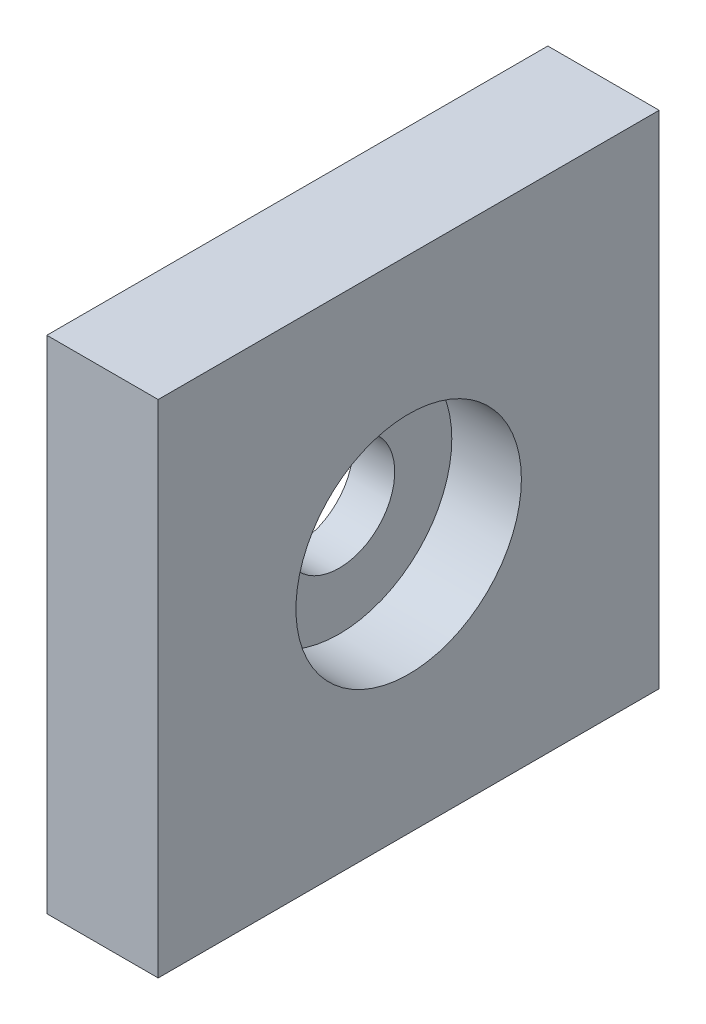
ISO-10303-21;
HEADER;
FILE_DESCRIPTION(('STEP AP214'),'2;1');
FILE_NAME('part.step','',(''),(''),'','','');
FILE_SCHEMA(('AUTOMOTIVE_DESIGN { 1 0 10303 214 1 1 1 1 }'));
ENDSEC;
DATA;
#1=APPLICATION_CONTEXT('core data for automotive mechanical design processes');
#2=APPLICATION_PROTOCOL_DEFINITION('international standard','automotive_design',2000,#1);
#3=PRODUCT_CONTEXT('',#1,'mechanical');
#4=PRODUCT('Part','Part','',(#3));
#5=PRODUCT_RELATED_PRODUCT_CATEGORY('part','',(#4));
#6=PRODUCT_DEFINITION_FORMATION('','',#4);
#7=PRODUCT_DEFINITION_CONTEXT('part definition',#1,'design');
#8=PRODUCT_DEFINITION('design','',#6,#7);
#9=PRODUCT_DEFINITION_SHAPE('','',#8);
#10=(LENGTH_UNIT() NAMED_UNIT(*) SI_UNIT(.MILLI.,.METRE.));
#11=(NAMED_UNIT(*) PLANE_ANGLE_UNIT() SI_UNIT($,.RADIAN.));
#12=(NAMED_UNIT(*) SI_UNIT($,.STERADIAN.) SOLID_ANGLE_UNIT());
#13=UNCERTAINTY_MEASURE_WITH_UNIT(LENGTH_MEASURE(1.E-05),#10,'distance_accuracy_value','');
#14=(GEOMETRIC_REPRESENTATION_CONTEXT(3) GLOBAL_UNCERTAINTY_ASSIGNED_CONTEXT((#13)) GLOBAL_UNIT_ASSIGNED_CONTEXT((#10,
#11,#12)) REPRESENTATION_CONTEXT('',''));
#15=CARTESIAN_POINT('',(0.,0.,0.));
#16=DIRECTION('',(0.,0.,1.));
#17=DIRECTION('',(1.,0.,0.));
#18=AXIS2_PLACEMENT_3D('',#15,#16,#17);
#19=CARTESIAN_POINT('',(-2.,18.,-18.));
#20=DIRECTION('',(1.,0.,0.));
#21=DIRECTION('',(0.,0.,-1.));
#22=AXIS2_PLACEMENT_3D('',#19,#20,#21);
#23=CYLINDRICAL_SURFACE('',#22,8.1);
#24=CARTESIAN_POINT('',(8.,18.,-18.));
#25=DIRECTION('',(1.,0.,0.));
#26=DIRECTION('',(0.,0.,-1.));
#27=AXIS2_PLACEMENT_3D('',#24,#25,#26);
#28=CIRCLE('',#27,8.1);
#29=CARTESIAN_POINT('',(8.,18.,-26.1));
#30=VERTEX_POINT('',#29);
#31=EDGE_CURVE('E108',#30,#30,#28,.T.);
#32=ORIENTED_EDGE('',*,*,#31,.T.);
#33=EDGE_LOOP('',(#32));
#34=FACE_BOUND('',#33,.T.);
#35=CARTESIAN_POINT('',(3.,18.,-18.));
#36=DIRECTION('',(-1.,0.,0.));
#37=DIRECTION('',(0.,0.,1.));
#38=AXIS2_PLACEMENT_3D('',#35,#36,#37);
#39=CIRCLE('',#38,8.1);
#40=CARTESIAN_POINT('',(3.,18.,-9.9));
#41=VERTEX_POINT('',#40);
#42=EDGE_CURVE('E11',#41,#41,#39,.F.);
#43=ORIENTED_EDGE('',*,*,#42,.F.);
#44=EDGE_LOOP('',(#43));
#45=FACE_BOUND('',#44,.T.);
#46=ADVANCED_FACE('F39',(#34,#45),#23,.F.);
#47=CARTESIAN_POINT('',(0.,36.,0.));
#48=DIRECTION('',(0.,0.,1.));
#49=DIRECTION('',(1.,0.,0.));
#50=AXIS2_PLACEMENT_3D('',#47,#48,#49);
#51=PLANE('',#50);
#52=DIRECTION('',(-1.,0.,0.));
#53=VECTOR('',#52,1.);
#54=CARTESIAN_POINT('',(0.,0.,0.));
#55=LINE('',#54,#53);
#56=CARTESIAN_POINT('',(8.,0.,0.));
#57=VERTEX_POINT('',#56);
#58=CARTESIAN_POINT('',(0.,0.,0.));
#59=VERTEX_POINT('',#58);
#60=EDGE_CURVE('E106',#57,#59,#55,.T.);
#61=ORIENTED_EDGE('',*,*,#60,.F.);
#62=DIRECTION('',(0.,-1.,0.));
#63=VECTOR('',#62,1.);
#64=CARTESIAN_POINT('',(8.,36.,0.));
#65=LINE('',#64,#63);
#66=CARTESIAN_POINT('',(8.,36.,0.));
#67=VERTEX_POINT('',#66);
#68=EDGE_CURVE('E48',#67,#57,#65,.T.);
#69=ORIENTED_EDGE('',*,*,#68,.F.);
#70=DIRECTION('',(-1.,0.,0.));
#71=VECTOR('',#70,1.);
#72=CARTESIAN_POINT('',(0.,36.,0.));
#73=LINE('',#72,#71);
#74=CARTESIAN_POINT('',(0.,36.,0.));
#75=VERTEX_POINT('',#74);
#76=EDGE_CURVE('E98',#67,#75,#73,.T.);
#77=ORIENTED_EDGE('',*,*,#76,.T.);
#78=DIRECTION('',(0.,-1.,0.));
#79=VECTOR('',#78,1.);
#80=CARTESIAN_POINT('',(0.,36.,0.));
#81=LINE('',#80,#79);
#82=EDGE_CURVE('E56',#75,#59,#81,.T.);
#83=ORIENTED_EDGE('',*,*,#82,.T.);
#84=EDGE_LOOP('',(#61,#69,#77,#83));
#85=FACE_BOUND('',#84,.T.);
#86=ADVANCED_FACE('F41',(#85),#51,.T.);
#87=CARTESIAN_POINT('',(8.,36.,0.));
#88=DIRECTION('',(1.,0.,0.));
#89=DIRECTION('',(0.,0.,-1.));
#90=AXIS2_PLACEMENT_3D('',#87,#88,#89);
#91=PLANE('',#90);
#92=ORIENTED_EDGE('',*,*,#31,.F.);
#93=EDGE_LOOP('',(#92));
#94=FACE_BOUND('',#93,.T.);
#95=DIRECTION('',(0.,0.,1.));
#96=VECTOR('',#95,1.);
#97=CARTESIAN_POINT('',(8.,0.,0.));
#98=LINE('',#97,#96);
#99=CARTESIAN_POINT('',(8.,0.,-36.));
#100=VERTEX_POINT('',#99);
#101=EDGE_CURVE('E88',#100,#57,#98,.T.);
#102=ORIENTED_EDGE('',*,*,#101,.F.);
#103=DIRECTION('',(0.,-1.,0.));
#104=VECTOR('',#103,1.);
#105=CARTESIAN_POINT('',(8.,36.,-36.));
#106=LINE('',#105,#104);
#107=CARTESIAN_POINT('',(8.,36.,-36.));
#108=VERTEX_POINT('',#107);
#109=EDGE_CURVE('E83',#108,#100,#106,.T.);
#110=ORIENTED_EDGE('',*,*,#109,.F.);
#111=DIRECTION('',(0.,0.,1.));
#112=VECTOR('',#111,1.);
#113=CARTESIAN_POINT('',(8.,36.,0.));
#114=LINE('',#113,#112);
#115=EDGE_CURVE('E86',#108,#67,#114,.T.);
#116=ORIENTED_EDGE('',*,*,#115,.T.);
#117=ORIENTED_EDGE('',*,*,#68,.T.);
#118=EDGE_LOOP('',(#102,#110,#116,#117));
#119=FACE_BOUND('',#118,.T.);
#120=ADVANCED_FACE('F85',(#94,#119),#91,.T.);
#121=CARTESIAN_POINT('',(0.,36.,-36.));
#122=DIRECTION('',(0.,0.,-1.));
#123=DIRECTION('',(-1.,0.,0.));
#124=AXIS2_PLACEMENT_3D('',#121,#122,#123);
#125=PLANE('',#124);
#126=DIRECTION('',(1.,0.,0.));
#127=VECTOR('',#126,1.);
#128=CARTESIAN_POINT('',(0.,0.,-36.));
#129=LINE('',#128,#127);
#130=CARTESIAN_POINT('',(0.,0.,-36.));
#131=VERTEX_POINT('',#130);
#132=EDGE_CURVE('E110',#131,#100,#129,.T.);
#133=ORIENTED_EDGE('',*,*,#132,.F.);
#134=DIRECTION('',(0.,-1.,0.));
#135=VECTOR('',#134,1.);
#136=CARTESIAN_POINT('',(0.,36.,-36.));
#137=LINE('',#136,#135);
#138=CARTESIAN_POINT('',(0.,36.,-36.));
#139=VERTEX_POINT('',#138);
#140=EDGE_CURVE('E70',#139,#131,#137,.T.);
#141=ORIENTED_EDGE('',*,*,#140,.F.);
#142=DIRECTION('',(1.,0.,0.));
#143=VECTOR('',#142,1.);
#144=CARTESIAN_POINT('',(0.,36.,-36.));
#145=LINE('',#144,#143);
#146=EDGE_CURVE('E97',#139,#108,#145,.T.);
#147=ORIENTED_EDGE('',*,*,#146,.T.);
#148=ORIENTED_EDGE('',*,*,#109,.T.);
#149=EDGE_LOOP('',(#133,#141,#147,#148));
#150=FACE_BOUND('',#149,.T.);
#151=ADVANCED_FACE('F100',(#150),#125,.T.);
#152=CARTESIAN_POINT('',(0.,36.,0.));
#153=DIRECTION('',(-1.,0.,0.));
#154=DIRECTION('',(0.,0.,1.));
#155=AXIS2_PLACEMENT_3D('',#152,#153,#154);
#156=PLANE('',#155);
#157=DIRECTION('',(0.,0.,-1.));
#158=VECTOR('',#157,1.);
#159=CARTESIAN_POINT('',(0.,0.,0.));
#160=LINE('',#159,#158);
#161=EDGE_CURVE('E112',#59,#131,#160,.T.);
#162=ORIENTED_EDGE('',*,*,#161,.F.);
#163=ORIENTED_EDGE('',*,*,#82,.F.);
#164=DIRECTION('',(0.,0.,-1.));
#165=VECTOR('',#164,1.);
#166=CARTESIAN_POINT('',(0.,36.,0.));
#167=LINE('',#166,#165);
#168=EDGE_CURVE('E101',#75,#139,#167,.T.);
#169=ORIENTED_EDGE('',*,*,#168,.T.);
#170=ORIENTED_EDGE('',*,*,#140,.T.);
#171=EDGE_LOOP('',(#162,#163,#169,#170));
#172=FACE_BOUND('',#171,.T.);
#173=CARTESIAN_POINT('',(0.,18.,-18.));
#174=DIRECTION('',(-1.,0.,0.));
#175=DIRECTION('',(0.,0.,1.));
#176=AXIS2_PLACEMENT_3D('',#173,#174,#175);
#177=CIRCLE('',#176,4.);
#178=CARTESIAN_POINT('',(0.,18.,-14.));
#179=VERTEX_POINT('',#178);
#180=EDGE_CURVE('E124',#179,#179,#177,.T.);
#181=ORIENTED_EDGE('',*,*,#180,.F.);
#182=EDGE_LOOP('',(#181));
#183=FACE_BOUND('',#182,.T.);
#184=ADVANCED_FACE('F118',(#172,#183),#156,.T.);
#185=CARTESIAN_POINT('',(0.,36.,0.));
#186=DIRECTION('',(0.,1.,0.));
#187=DIRECTION('',(0.,0.,1.));
#188=AXIS2_PLACEMENT_3D('',#185,#186,#187);
#189=PLANE('',#188);
#190=ORIENTED_EDGE('',*,*,#76,.F.);
#191=ORIENTED_EDGE('',*,*,#115,.F.);
#192=ORIENTED_EDGE('',*,*,#146,.F.);
#193=ORIENTED_EDGE('',*,*,#168,.F.);
#194=EDGE_LOOP('',(#190,#191,#192,#193));
#195=FACE_BOUND('',#194,.T.);
#196=ADVANCED_FACE('F95',(#195),#189,.T.);
#197=CARTESIAN_POINT('',(0.,0.,0.));
#198=DIRECTION('',(0.,1.,0.));
#199=DIRECTION('',(0.,0.,1.));
#200=AXIS2_PLACEMENT_3D('',#197,#198,#199);
#201=PLANE('',#200);
#202=CARTESIAN_POINT('',(4.,0.,-4.));
#203=DIRECTION('',(0.,-1.,0.));
#204=DIRECTION('',(0.,0.,-1.));
#205=AXIS2_PLACEMENT_3D('',#202,#203,#204);
#206=CIRCLE('',#205,2.);
#207=CARTESIAN_POINT('',(4.,0.,-6.));
#208=VERTEX_POINT('',#207);
#209=EDGE_CURVE('E132',#208,#208,#206,.T.);
#210=ORIENTED_EDGE('',*,*,#209,.F.);
#211=EDGE_LOOP('',(#210));
#212=FACE_BOUND('',#211,.T.);
#213=CARTESIAN_POINT('',(4.,0.,-32.));
#214=DIRECTION('',(0.,-1.,0.));
#215=DIRECTION('',(0.,0.,-1.));
#216=AXIS2_PLACEMENT_3D('',#213,#214,#215);
#217=CIRCLE('',#216,2.);
#218=CARTESIAN_POINT('',(4.,0.,-34.));
#219=VERTEX_POINT('',#218);
#220=EDGE_CURVE('E169',#219,#219,#217,.T.);
#221=ORIENTED_EDGE('',*,*,#220,.F.);
#222=EDGE_LOOP('',(#221));
#223=FACE_BOUND('',#222,.T.);
#224=ORIENTED_EDGE('',*,*,#60,.T.);
#225=ORIENTED_EDGE('',*,*,#161,.T.);
#226=ORIENTED_EDGE('',*,*,#132,.T.);
#227=ORIENTED_EDGE('',*,*,#101,.T.);
#228=EDGE_LOOP('',(#224,#225,#226,#227));
#229=FACE_BOUND('',#228,.T.);
#230=ADVANCED_FACE('F117',(#212,#223,#229),#201,.F.);
#231=CARTESIAN_POINT('',(3.,18.,-18.));
#232=DIRECTION('',(-1.,0.,0.));
#233=DIRECTION('',(0.,0.,1.));
#234=AXIS2_PLACEMENT_3D('',#231,#232,#233);
#235=PLANE('',#234);
#236=CARTESIAN_POINT('',(3.,18.,-18.));
#237=DIRECTION('',(-1.,0.,0.));
#238=DIRECTION('',(0.,0.,1.));
#239=AXIS2_PLACEMENT_3D('',#236,#237,#238);
#240=CIRCLE('',#239,4.);
#241=CARTESIAN_POINT('',(3.,18.,-14.));
#242=VERTEX_POINT('',#241);
#243=EDGE_CURVE('E126',#242,#242,#240,.T.);
#244=ORIENTED_EDGE('',*,*,#243,.T.);
#245=EDGE_LOOP('',(#244));
#246=FACE_BOUND('',#245,.T.);
#247=ORIENTED_EDGE('',*,*,#42,.T.);
#248=EDGE_LOOP('',(#247));
#249=FACE_BOUND('',#248,.T.);
#250=ADVANCED_FACE('F153',(#246,#249),#235,.F.);
#251=CARTESIAN_POINT('',(3.,18.,-18.));
#252=DIRECTION('',(-1.,0.,0.));
#253=DIRECTION('',(0.,0.,1.));
#254=AXIS2_PLACEMENT_3D('',#251,#252,#253);
#255=CYLINDRICAL_SURFACE('',#254,4.);
#256=ORIENTED_EDGE('',*,*,#243,.F.);
#257=EDGE_LOOP('',(#256));
#258=FACE_BOUND('',#257,.T.);
#259=ORIENTED_EDGE('',*,*,#180,.T.);
#260=EDGE_LOOP('',(#259));
#261=FACE_BOUND('',#260,.T.);
#262=ADVANCED_FACE('F162',(#258,#261),#255,.F.);
#263=CARTESIAN_POINT('',(4.,15.,-32.));
#264=DIRECTION('',(0.,-1.,0.));
#265=DIRECTION('',(0.,0.,-1.));
#266=AXIS2_PLACEMENT_3D('',#263,#264,#265);
#267=CYLINDRICAL_SURFACE('',#266,2.);
#268=CARTESIAN_POINT('',(4.,15.,-32.));
#269=DIRECTION('',(0.,-1.,0.));
#270=DIRECTION('',(0.,0.,-1.));
#271=AXIS2_PLACEMENT_3D('',#268,#269,#270);
#272=CIRCLE('',#271,2.);
#273=CARTESIAN_POINT('',(4.,15.,-34.));
#274=VERTEX_POINT('',#273);
#275=EDGE_CURVE('E171',#274,#274,#272,.T.);
#276=ORIENTED_EDGE('',*,*,#275,.F.);
#277=EDGE_LOOP('',(#276));
#278=FACE_BOUND('',#277,.T.);
#279=ORIENTED_EDGE('',*,*,#220,.T.);
#280=EDGE_LOOP('',(#279));
#281=FACE_BOUND('',#280,.T.);
#282=ADVANCED_FACE('F188',(#278,#281),#267,.F.);
#283=CARTESIAN_POINT('',(4.,15.,-32.));
#284=DIRECTION('',(0.,-1.,0.));
#285=DIRECTION('',(0.,0.,-1.));
#286=AXIS2_PLACEMENT_3D('',#283,#284,#285);
#287=PLANE('',#286);
#288=ORIENTED_EDGE('',*,*,#275,.T.);
#289=EDGE_LOOP('',(#288));
#290=FACE_BOUND('',#289,.T.);
#291=ADVANCED_FACE('F179',(#290),#287,.T.);
#292=CARTESIAN_POINT('',(4.,15.,-4.));
#293=DIRECTION('',(0.,-1.,0.));
#294=DIRECTION('',(0.,0.,-1.));
#295=AXIS2_PLACEMENT_3D('',#292,#293,#294);
#296=CYLINDRICAL_SURFACE('',#295,2.);
#297=CARTESIAN_POINT('',(4.,15.,-4.));
#298=DIRECTION('',(0.,-1.,0.));
#299=DIRECTION('',(0.,0.,-1.));
#300=AXIS2_PLACEMENT_3D('',#297,#298,#299);
#301=CIRCLE('',#300,2.);
#302=CARTESIAN_POINT('',(4.,15.,-6.));
#303=VERTEX_POINT('',#302);
#304=EDGE_CURVE('E127',#303,#303,#301,.T.);
#305=ORIENTED_EDGE('',*,*,#304,.F.);
#306=EDGE_LOOP('',(#305));
#307=FACE_BOUND('',#306,.T.);
#308=ORIENTED_EDGE('',*,*,#209,.T.);
#309=EDGE_LOOP('',(#308));
#310=FACE_BOUND('',#309,.T.);
#311=ADVANCED_FACE('F176',(#307,#310),#296,.F.);
#312=CARTESIAN_POINT('',(4.,15.,-4.));
#313=DIRECTION('',(0.,-1.,0.));
#314=DIRECTION('',(0.,0.,-1.));
#315=AXIS2_PLACEMENT_3D('',#312,#313,#314);
#316=PLANE('',#315);
#317=ORIENTED_EDGE('',*,*,#304,.T.);
#318=EDGE_LOOP('',(#317));
#319=FACE_BOUND('',#318,.T.);
#320=ADVANCED_FACE('F178',(#319),#316,.T.);
#321=CLOSED_SHELL('',(#46,#86,#120,#151,#184,#196,#230,#250,#262,#282,#291,#311,#320));
#322=MANIFOLD_SOLID_BREP('B2',#321);
#323=ADVANCED_BREP_SHAPE_REPRESENTATION('',(#18,#322),#14);
#324=SHAPE_DEFINITION_REPRESENTATION(#9,#323);
ENDSEC;
END-ISO-10303-21;
